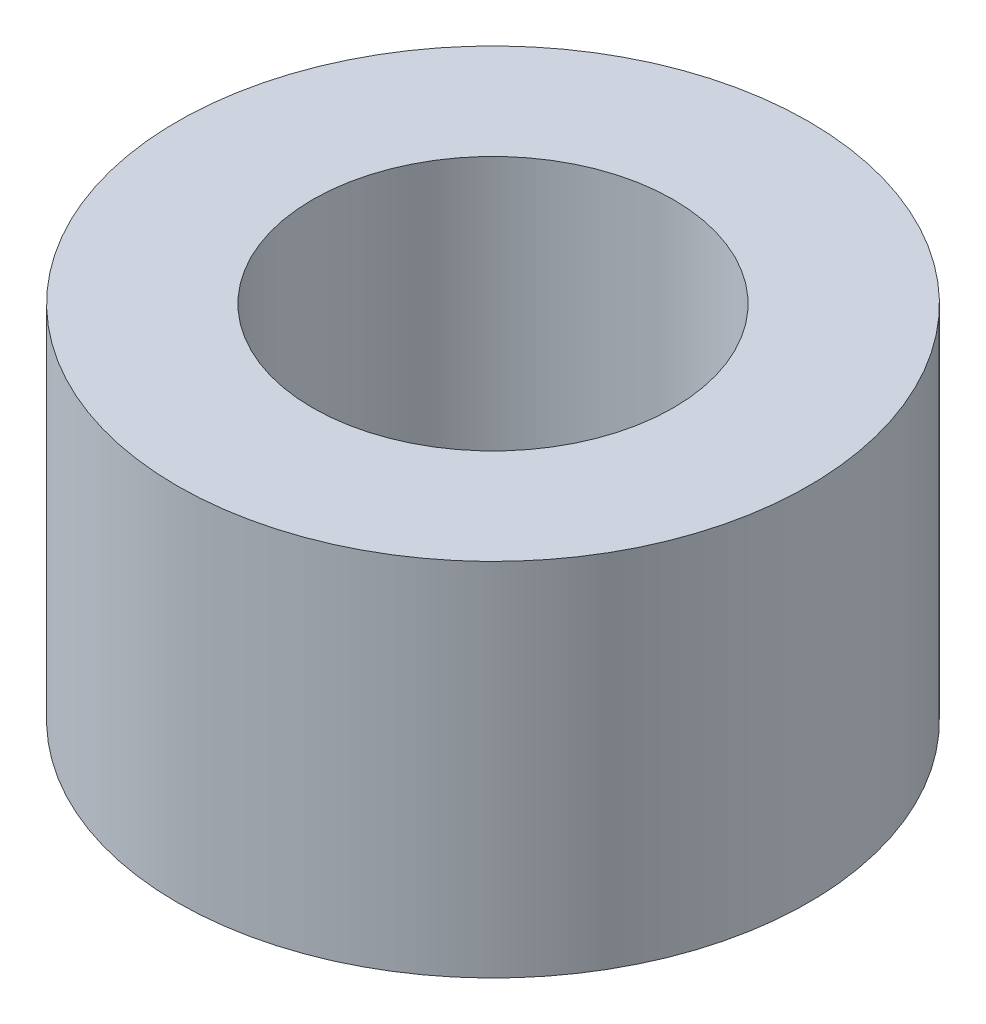
ISO-10303-21;
HEADER;
FILE_DESCRIPTION(('STEP AP214'),'2;1');
FILE_NAME('part.step','',(''),(''),'','','');
FILE_SCHEMA(('AUTOMOTIVE_DESIGN { 1 0 10303 214 1 1 1 1 }'));
ENDSEC;
DATA;
#1=APPLICATION_CONTEXT('core data for automotive mechanical design processes');
#2=APPLICATION_PROTOCOL_DEFINITION('international standard','automotive_design',2000,#1);
#3=PRODUCT_CONTEXT('',#1,'mechanical');
#4=PRODUCT('Part','Part','',(#3));
#5=PRODUCT_RELATED_PRODUCT_CATEGORY('part','',(#4));
#6=PRODUCT_DEFINITION_FORMATION('','',#4);
#7=PRODUCT_DEFINITION_CONTEXT('part definition',#1,'design');
#8=PRODUCT_DEFINITION('design','',#6,#7);
#9=PRODUCT_DEFINITION_SHAPE('','',#8);
#10=(LENGTH_UNIT() NAMED_UNIT(*) SI_UNIT(.MILLI.,.METRE.));
#11=(NAMED_UNIT(*) PLANE_ANGLE_UNIT() SI_UNIT($,.RADIAN.));
#12=(NAMED_UNIT(*) SI_UNIT($,.STERADIAN.) SOLID_ANGLE_UNIT());
#13=UNCERTAINTY_MEASURE_WITH_UNIT(LENGTH_MEASURE(1.E-05),#10,'distance_accuracy_value','');
#14=(GEOMETRIC_REPRESENTATION_CONTEXT(3) GLOBAL_UNCERTAINTY_ASSIGNED_CONTEXT((#13)) GLOBAL_UNIT_ASSIGNED_CONTEXT((#10,
#11,#12)) REPRESENTATION_CONTEXT('',''));
#15=CARTESIAN_POINT('',(0.,0.,0.));
#16=DIRECTION('',(0.,0.,1.));
#17=DIRECTION('',(1.,0.,0.));
#18=AXIS2_PLACEMENT_3D('',#15,#16,#17);
#19=CARTESIAN_POINT('',(0.,10.,0.));
#20=DIRECTION('',(0.,1.,0.));
#21=DIRECTION('',(0.,0.,1.));
#22=AXIS2_PLACEMENT_3D('',#19,#20,#21);
#23=PLANE('',#22);
#24=CARTESIAN_POINT('',(0.,10.,0.));
#25=DIRECTION('',(0.,1.,0.));
#26=DIRECTION('',(0.,0.,1.));
#27=AXIS2_PLACEMENT_3D('',#24,#25,#26);
#28=CIRCLE('',#27,17.5);
#29=CARTESIAN_POINT('',(0.,10.,17.5));
#30=VERTEX_POINT('',#29);
#31=EDGE_CURVE('E10',#30,#30,#28,.T.);
#32=ORIENTED_EDGE('',*,*,#31,.T.);
#33=EDGE_LOOP('',(#32));
#34=FACE_BOUND('',#33,.T.);
#35=CARTESIAN_POINT('',(0.,10.,0.));
#36=DIRECTION('',(0.,1.,0.));
#37=DIRECTION('',(0.,0.,1.));
#38=AXIS2_PLACEMENT_3D('',#35,#36,#37);
#39=CIRCLE('',#38,10.);
#40=CARTESIAN_POINT('',(0.,10.,10.));
#41=VERTEX_POINT('',#40);
#42=EDGE_CURVE('E50',#41,#41,#39,.T.);
#43=ORIENTED_EDGE('',*,*,#42,.F.);
#44=EDGE_LOOP('',(#43));
#45=FACE_BOUND('',#44,.T.);
#46=ADVANCED_FACE('F37',(#34,#45),#23,.T.);
#47=CARTESIAN_POINT('',(0.,-10.,0.));
#48=DIRECTION('',(0.,1.,0.));
#49=DIRECTION('',(0.,0.,1.));
#50=AXIS2_PLACEMENT_3D('',#47,#48,#49);
#51=PLANE('',#50);
#52=CARTESIAN_POINT('',(0.,-10.,0.));
#53=DIRECTION('',(0.,1.,0.));
#54=DIRECTION('',(0.,0.,1.));
#55=AXIS2_PLACEMENT_3D('',#52,#53,#54);
#56=CIRCLE('',#55,17.5);
#57=CARTESIAN_POINT('',(0.,-10.,17.5));
#58=VERTEX_POINT('',#57);
#59=EDGE_CURVE('E41',#58,#58,#56,.T.);
#60=ORIENTED_EDGE('',*,*,#59,.F.);
#61=EDGE_LOOP('',(#60));
#62=FACE_BOUND('',#61,.T.);
#63=CARTESIAN_POINT('',(0.,-10.,0.));
#64=DIRECTION('',(0.,1.,0.));
#65=DIRECTION('',(0.,0.,1.));
#66=AXIS2_PLACEMENT_3D('',#63,#64,#65);
#67=CIRCLE('',#66,10.);
#68=CARTESIAN_POINT('',(0.,-10.,10.));
#69=VERTEX_POINT('',#68);
#70=EDGE_CURVE('E52',#69,#69,#67,.T.);
#71=ORIENTED_EDGE('',*,*,#70,.T.);
#72=EDGE_LOOP('',(#71));
#73=FACE_BOUND('',#72,.T.);
#74=ADVANCED_FACE('F64',(#62,#73),#51,.F.);
#75=CARTESIAN_POINT('',(0.,10.,0.));
#76=DIRECTION('',(0.,-1.,0.));
#77=DIRECTION('',(0.,0.,-1.));
#78=AXIS2_PLACEMENT_3D('',#75,#76,#77);
#79=CYLINDRICAL_SURFACE('',#78,17.5);
#80=ORIENTED_EDGE('',*,*,#31,.F.);
#81=EDGE_LOOP('',(#80));
#82=FACE_BOUND('',#81,.T.);
#83=ORIENTED_EDGE('',*,*,#59,.T.);
#84=EDGE_LOOP('',(#83));
#85=FACE_BOUND('',#84,.T.);
#86=ADVANCED_FACE('F39',(#82,#85),#79,.T.);
#87=CARTESIAN_POINT('',(0.,10.,0.));
#88=DIRECTION('',(0.,-1.,0.));
#89=DIRECTION('',(0.,0.,-1.));
#90=AXIS2_PLACEMENT_3D('',#87,#88,#89);
#91=CYLINDRICAL_SURFACE('',#90,10.);
#92=ORIENTED_EDGE('',*,*,#42,.T.);
#93=EDGE_LOOP('',(#92));
#94=FACE_BOUND('',#93,.T.);
#95=ORIENTED_EDGE('',*,*,#70,.F.);
#96=EDGE_LOOP('',(#95));
#97=FACE_BOUND('',#96,.T.);
#98=ADVANCED_FACE('F60',(#94,#97),#91,.F.);
#99=CLOSED_SHELL('',(#46,#74,#86,#98));
#100=MANIFOLD_SOLID_BREP('B2',#99);
#101=ADVANCED_BREP_SHAPE_REPRESENTATION('',(#18,#100),#14);
#102=SHAPE_DEFINITION_REPRESENTATION(#9,#101);
ENDSEC;
END-ISO-10303-21;
